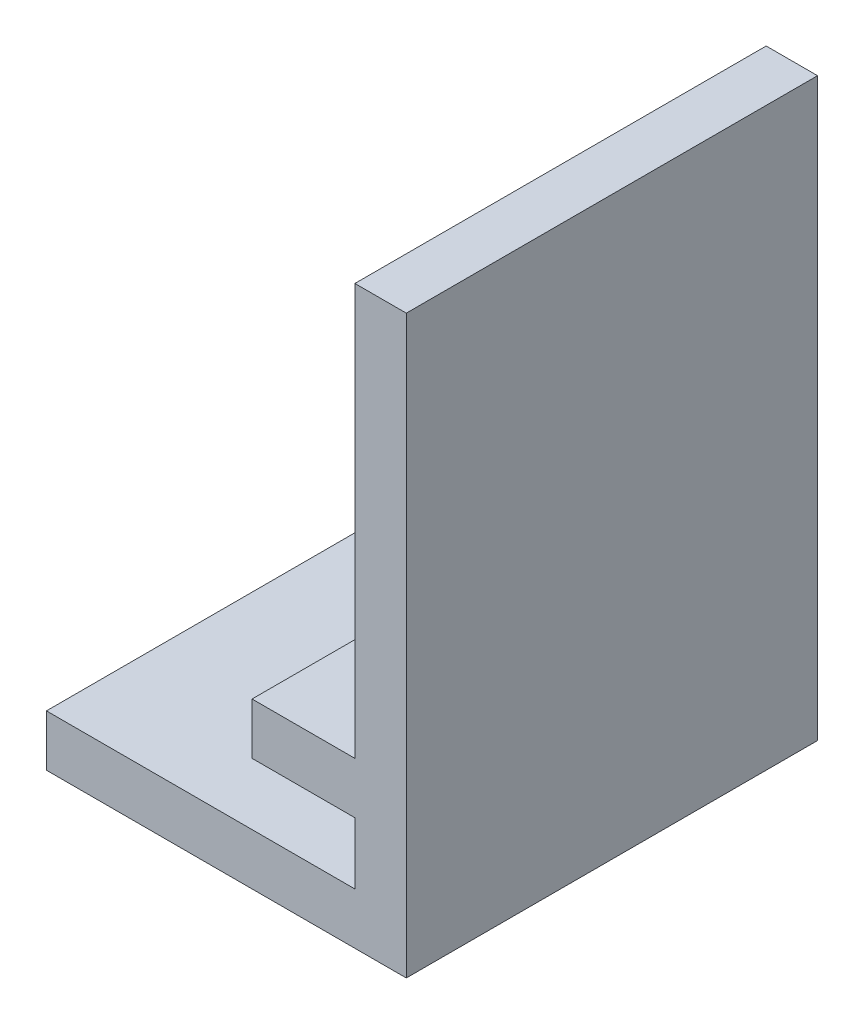
ISO-10303-21;
HEADER;
FILE_DESCRIPTION(('STEP AP214'),'2;1');
FILE_NAME('part.step','',(''),(''),'','','');
FILE_SCHEMA(('AUTOMOTIVE_DESIGN { 1 0 10303 214 1 1 1 1 }'));
ENDSEC;
DATA;
#1=APPLICATION_CONTEXT('core data for automotive mechanical design processes');
#2=APPLICATION_PROTOCOL_DEFINITION('international standard','automotive_design',2000,#1);
#3=PRODUCT_CONTEXT('',#1,'mechanical');
#4=PRODUCT('Part','Part','',(#3));
#5=PRODUCT_RELATED_PRODUCT_CATEGORY('part','',(#4));
#6=PRODUCT_DEFINITION_FORMATION('','',#4);
#7=PRODUCT_DEFINITION_CONTEXT('part definition',#1,'design');
#8=PRODUCT_DEFINITION('design','',#6,#7);
#9=PRODUCT_DEFINITION_SHAPE('','',#8);
#10=(LENGTH_UNIT() NAMED_UNIT(*) SI_UNIT(.MILLI.,.METRE.));
#11=(NAMED_UNIT(*) PLANE_ANGLE_UNIT() SI_UNIT($,.RADIAN.));
#12=(NAMED_UNIT(*) SI_UNIT($,.STERADIAN.) SOLID_ANGLE_UNIT());
#13=UNCERTAINTY_MEASURE_WITH_UNIT(LENGTH_MEASURE(1.E-05),#10,'distance_accuracy_value','');
#14=(GEOMETRIC_REPRESENTATION_CONTEXT(3) GLOBAL_UNCERTAINTY_ASSIGNED_CONTEXT((#13)) GLOBAL_UNIT_ASSIGNED_CONTEXT((#10,
#11,#12)) REPRESENTATION_CONTEXT('',''));
#15=CARTESIAN_POINT('',(0.,0.,0.));
#16=DIRECTION('',(0.,0.,1.));
#17=DIRECTION('',(1.,0.,0.));
#18=AXIS2_PLACEMENT_3D('',#15,#16,#17);
#19=CARTESIAN_POINT('',(-22.225,0.,25.4));
#20=DIRECTION('',(0.,1.,0.));
#21=DIRECTION('',(0.,0.,1.));
#22=AXIS2_PLACEMENT_3D('',#19,#20,#21);
#23=PLANE('',#22);
#24=DIRECTION('',(1.,0.,0.));
#25=VECTOR('',#24,1.);
#26=CARTESIAN_POINT('',(-22.225,0.,0.));
#27=LINE('',#26,#25);
#28=CARTESIAN_POINT('',(-22.225,0.,0.));
#29=VERTEX_POINT('',#28);
#30=CARTESIAN_POINT('',(0.,0.,0.));
#31=VERTEX_POINT('',#30);
#32=EDGE_CURVE('E140',#29,#31,#27,.T.);
#33=ORIENTED_EDGE('',*,*,#32,.T.);
#34=DIRECTION('',(0.,0.,-1.));
#35=VECTOR('',#34,1.);
#36=CARTESIAN_POINT('',(0.,0.,25.4));
#37=LINE('',#36,#35);
#38=CARTESIAN_POINT('',(0.,0.,25.4));
#39=VERTEX_POINT('',#38);
#40=EDGE_CURVE('E11',#39,#31,#37,.T.);
#41=ORIENTED_EDGE('',*,*,#40,.F.);
#42=DIRECTION('',(1.,0.,0.));
#43=VECTOR('',#42,1.);
#44=CARTESIAN_POINT('',(-22.225,0.,25.4));
#45=LINE('',#44,#43);
#46=CARTESIAN_POINT('',(-22.225,0.,25.4));
#47=VERTEX_POINT('',#46);
#48=EDGE_CURVE('E158',#47,#39,#45,.T.);
#49=ORIENTED_EDGE('',*,*,#48,.F.);
#50=DIRECTION('',(0.,0.,-1.));
#51=VECTOR('',#50,1.);
#52=CARTESIAN_POINT('',(-22.225,0.,25.4));
#53=LINE('',#52,#51);
#54=EDGE_CURVE('E136',#47,#29,#53,.T.);
#55=ORIENTED_EDGE('',*,*,#54,.T.);
#56=EDGE_LOOP('',(#33,#41,#49,#55));
#57=FACE_BOUND('',#56,.T.);
#58=ADVANCED_FACE('F32',(#57),#23,.F.);
#59=CARTESIAN_POINT('',(0.,0.,25.4));
#60=DIRECTION('',(-1.,0.,0.));
#61=DIRECTION('',(0.,-1.,0.));
#62=AXIS2_PLACEMENT_3D('',#59,#60,#61);
#63=PLANE('',#62);
#64=DIRECTION('',(0.,1.,0.));
#65=VECTOR('',#64,1.);
#66=CARTESIAN_POINT('',(0.,0.,0.));
#67=LINE('',#66,#65);
#68=CARTESIAN_POINT('',(0.,35.56,0.));
#69=VERTEX_POINT('',#68);
#70=EDGE_CURVE('E143',#31,#69,#67,.T.);
#71=ORIENTED_EDGE('',*,*,#70,.T.);
#72=DIRECTION('',(0.,0.,-1.));
#73=VECTOR('',#72,1.);
#74=CARTESIAN_POINT('',(0.,35.56,25.4));
#75=LINE('',#74,#73);
#76=CARTESIAN_POINT('',(0.,35.56,25.4));
#77=VERTEX_POINT('',#76);
#78=EDGE_CURVE('E40',#77,#69,#75,.T.);
#79=ORIENTED_EDGE('',*,*,#78,.F.);
#80=DIRECTION('',(0.,1.,0.));
#81=VECTOR('',#80,1.);
#82=CARTESIAN_POINT('',(0.,0.,25.4));
#83=LINE('',#82,#81);
#84=EDGE_CURVE('E97',#39,#77,#83,.T.);
#85=ORIENTED_EDGE('',*,*,#84,.F.);
#86=ORIENTED_EDGE('',*,*,#40,.T.);
#87=EDGE_LOOP('',(#71,#79,#85,#86));
#88=FACE_BOUND('',#87,.T.);
#89=ADVANCED_FACE('F207',(#88),#63,.F.);
#90=CARTESIAN_POINT('',(0.,35.56,25.4));
#91=DIRECTION('',(0.,-1.,0.));
#92=DIRECTION('',(0.,0.,-1.));
#93=AXIS2_PLACEMENT_3D('',#90,#91,#92);
#94=PLANE('',#93);
#95=DIRECTION('',(-1.,0.,0.));
#96=VECTOR('',#95,1.);
#97=CARTESIAN_POINT('',(0.,35.56,0.));
#98=LINE('',#97,#96);
#99=CARTESIAN_POINT('',(-3.175,35.56,0.));
#100=VERTEX_POINT('',#99);
#101=EDGE_CURVE('E145',#69,#100,#98,.T.);
#102=ORIENTED_EDGE('',*,*,#101,.T.);
#103=DIRECTION('',(0.,0.,-1.));
#104=VECTOR('',#103,1.);
#105=CARTESIAN_POINT('',(-3.175,35.56,25.4));
#106=LINE('',#105,#104);
#107=CARTESIAN_POINT('',(-3.175,35.56,25.4));
#108=VERTEX_POINT('',#107);
#109=EDGE_CURVE('E171',#108,#100,#106,.T.);
#110=ORIENTED_EDGE('',*,*,#109,.F.);
#111=DIRECTION('',(-1.,0.,0.));
#112=VECTOR('',#111,1.);
#113=CARTESIAN_POINT('',(0.,35.56,25.4));
#114=LINE('',#113,#112);
#115=EDGE_CURVE('E179',#77,#108,#114,.T.);
#116=ORIENTED_EDGE('',*,*,#115,.F.);
#117=ORIENTED_EDGE('',*,*,#78,.T.);
#118=EDGE_LOOP('',(#102,#110,#116,#117));
#119=FACE_BOUND('',#118,.T.);
#120=ADVANCED_FACE('F177',(#119),#94,.F.);
#121=CARTESIAN_POINT('',(-3.175,35.56,25.4));
#122=DIRECTION('',(1.,0.,0.));
#123=DIRECTION('',(0.,1.,0.));
#124=AXIS2_PLACEMENT_3D('',#121,#122,#123);
#125=PLANE('',#124);
#126=DIRECTION('',(0.,-1.,0.));
#127=VECTOR('',#126,1.);
#128=CARTESIAN_POINT('',(-3.175,35.56,0.));
#129=LINE('',#128,#127);
#130=CARTESIAN_POINT('',(-3.175,10.16,0.));
#131=VERTEX_POINT('',#130);
#132=EDGE_CURVE('E147',#100,#131,#129,.T.);
#133=ORIENTED_EDGE('',*,*,#132,.T.);
#134=DIRECTION('',(0.,0.,-1.));
#135=VECTOR('',#134,1.);
#136=CARTESIAN_POINT('',(-3.175,10.16,25.4));
#137=LINE('',#136,#135);
#138=CARTESIAN_POINT('',(-3.175,10.16,25.4));
#139=VERTEX_POINT('',#138);
#140=EDGE_CURVE('E168',#139,#131,#137,.T.);
#141=ORIENTED_EDGE('',*,*,#140,.F.);
#142=DIRECTION('',(0.,-1.,0.));
#143=VECTOR('',#142,1.);
#144=CARTESIAN_POINT('',(-3.175,35.56,25.4));
#145=LINE('',#144,#143);
#146=EDGE_CURVE('E197',#108,#139,#145,.T.);
#147=ORIENTED_EDGE('',*,*,#146,.F.);
#148=ORIENTED_EDGE('',*,*,#109,.T.);
#149=EDGE_LOOP('',(#133,#141,#147,#148));
#150=FACE_BOUND('',#149,.T.);
#151=ADVANCED_FACE('F188',(#150),#125,.F.);
#152=CARTESIAN_POINT('',(-3.175,10.16,25.4));
#153=DIRECTION('',(0.,-1.,0.));
#154=DIRECTION('',(1.,0.,0.));
#155=AXIS2_PLACEMENT_3D('',#152,#153,#154);
#156=PLANE('',#155);
#157=DIRECTION('',(-1.,0.,0.));
#158=VECTOR('',#157,1.);
#159=CARTESIAN_POINT('',(-3.175,10.16,0.));
#160=LINE('',#159,#158);
#161=CARTESIAN_POINT('',(-9.52499999999999,10.16,0.));
#162=VERTEX_POINT('',#161);
#163=EDGE_CURVE('E149',#131,#162,#160,.T.);
#164=ORIENTED_EDGE('',*,*,#163,.T.);
#165=DIRECTION('',(0.,0.,-1.));
#166=VECTOR('',#165,1.);
#167=CARTESIAN_POINT('',(-9.52499999999999,10.16,25.4));
#168=LINE('',#167,#166);
#169=CARTESIAN_POINT('',(-9.52499999999999,10.16,25.4));
#170=VERTEX_POINT('',#169);
#171=EDGE_CURVE('E165',#170,#162,#168,.T.);
#172=ORIENTED_EDGE('',*,*,#171,.F.);
#173=DIRECTION('',(-1.,0.,0.));
#174=VECTOR('',#173,1.);
#175=CARTESIAN_POINT('',(-3.175,10.16,25.4));
#176=LINE('',#175,#174);
#177=EDGE_CURVE('E194',#139,#170,#176,.T.);
#178=ORIENTED_EDGE('',*,*,#177,.F.);
#179=ORIENTED_EDGE('',*,*,#140,.T.);
#180=EDGE_LOOP('',(#164,#172,#178,#179));
#181=FACE_BOUND('',#180,.T.);
#182=ADVANCED_FACE('F192',(#181),#156,.F.);
#183=CARTESIAN_POINT('',(-9.52499999999999,10.16,25.4));
#184=DIRECTION('',(1.,0.,0.));
#185=DIRECTION('',(0.,1.,0.));
#186=AXIS2_PLACEMENT_3D('',#183,#184,#185);
#187=PLANE('',#186);
#188=DIRECTION('',(0.,-1.,0.));
#189=VECTOR('',#188,1.);
#190=CARTESIAN_POINT('',(-9.52499999999999,10.16,0.));
#191=LINE('',#190,#189);
#192=CARTESIAN_POINT('',(-9.525,6.985,0.));
#193=VERTEX_POINT('',#192);
#194=EDGE_CURVE('E151',#162,#193,#191,.T.);
#195=ORIENTED_EDGE('',*,*,#194,.T.);
#196=DIRECTION('',(0.,0.,-1.));
#197=VECTOR('',#196,1.);
#198=CARTESIAN_POINT('',(-9.525,6.985,25.4));
#199=LINE('',#198,#197);
#200=CARTESIAN_POINT('',(-9.525,6.985,25.4));
#201=VERTEX_POINT('',#200);
#202=EDGE_CURVE('E162',#201,#193,#199,.T.);
#203=ORIENTED_EDGE('',*,*,#202,.F.);
#204=DIRECTION('',(0.,-1.,0.));
#205=VECTOR('',#204,1.);
#206=CARTESIAN_POINT('',(-9.52499999999999,10.16,25.4));
#207=LINE('',#206,#205);
#208=EDGE_CURVE('E196',#170,#201,#207,.T.);
#209=ORIENTED_EDGE('',*,*,#208,.F.);
#210=ORIENTED_EDGE('',*,*,#171,.T.);
#211=EDGE_LOOP('',(#195,#203,#209,#210));
#212=FACE_BOUND('',#211,.T.);
#213=ADVANCED_FACE('F219',(#212),#187,.F.);
#214=CARTESIAN_POINT('',(-9.525,6.985,25.4));
#215=DIRECTION('',(0.,1.,0.));
#216=DIRECTION('',(-1.,0.,0.));
#217=AXIS2_PLACEMENT_3D('',#214,#215,#216);
#218=PLANE('',#217);
#219=DIRECTION('',(1.,0.,0.));
#220=VECTOR('',#219,1.);
#221=CARTESIAN_POINT('',(-9.525,6.985,0.));
#222=LINE('',#221,#220);
#223=CARTESIAN_POINT('',(-3.175,6.985,0.));
#224=VERTEX_POINT('',#223);
#225=EDGE_CURVE('E153',#193,#224,#222,.T.);
#226=ORIENTED_EDGE('',*,*,#225,.T.);
#227=DIRECTION('',(0.,0.,-1.));
#228=VECTOR('',#227,1.);
#229=CARTESIAN_POINT('',(-3.175,6.985,25.4));
#230=LINE('',#229,#228);
#231=CARTESIAN_POINT('',(-3.175,6.985,25.4));
#232=VERTEX_POINT('',#231);
#233=EDGE_CURVE('E131',#232,#224,#230,.T.);
#234=ORIENTED_EDGE('',*,*,#233,.F.);
#235=DIRECTION('',(1.,0.,0.));
#236=VECTOR('',#235,1.);
#237=CARTESIAN_POINT('',(-9.525,6.985,25.4));
#238=LINE('',#237,#236);
#239=EDGE_CURVE('E122',#201,#232,#238,.T.);
#240=ORIENTED_EDGE('',*,*,#239,.F.);
#241=ORIENTED_EDGE('',*,*,#202,.T.);
#242=EDGE_LOOP('',(#226,#234,#240,#241));
#243=FACE_BOUND('',#242,.T.);
#244=ADVANCED_FACE('F222',(#243),#218,.F.);
#245=CARTESIAN_POINT('',(-3.175,6.985,25.4));
#246=DIRECTION('',(1.,0.,0.));
#247=DIRECTION('',(0.,0.,-1.));
#248=AXIS2_PLACEMENT_3D('',#245,#246,#247);
#249=PLANE('',#248);
#250=DIRECTION('',(0.,-1.,0.));
#251=VECTOR('',#250,1.);
#252=CARTESIAN_POINT('',(-3.175,6.985,0.));
#253=LINE('',#252,#251);
#254=CARTESIAN_POINT('',(-3.175,3.175,0.));
#255=VERTEX_POINT('',#254);
#256=EDGE_CURVE('E130',#224,#255,#253,.T.);
#257=ORIENTED_EDGE('',*,*,#256,.T.);
#258=DIRECTION('',(0.,0.,-1.));
#259=VECTOR('',#258,1.);
#260=CARTESIAN_POINT('',(-3.175,3.175,25.4));
#261=LINE('',#260,#259);
#262=CARTESIAN_POINT('',(-3.175,3.175,25.4));
#263=VERTEX_POINT('',#262);
#264=EDGE_CURVE('E127',#263,#255,#261,.T.);
#265=ORIENTED_EDGE('',*,*,#264,.F.);
#266=DIRECTION('',(0.,-1.,0.));
#267=VECTOR('',#266,1.);
#268=CARTESIAN_POINT('',(-3.175,6.985,25.4));
#269=LINE('',#268,#267);
#270=EDGE_CURVE('E116',#232,#263,#269,.T.);
#271=ORIENTED_EDGE('',*,*,#270,.F.);
#272=ORIENTED_EDGE('',*,*,#233,.T.);
#273=EDGE_LOOP('',(#257,#265,#271,#272));
#274=FACE_BOUND('',#273,.T.);
#275=ADVANCED_FACE('F128',(#274),#249,.F.);
#276=CARTESIAN_POINT('',(-3.175,3.175,25.4));
#277=DIRECTION('',(0.,-1.,0.));
#278=DIRECTION('',(1.,0.,0.));
#279=AXIS2_PLACEMENT_3D('',#276,#277,#278);
#280=PLANE('',#279);
#281=DIRECTION('',(-1.,0.,0.));
#282=VECTOR('',#281,1.);
#283=CARTESIAN_POINT('',(-3.175,3.175,0.));
#284=LINE('',#283,#282);
#285=CARTESIAN_POINT('',(-22.225,3.175,0.));
#286=VERTEX_POINT('',#285);
#287=EDGE_CURVE('E83',#255,#286,#284,.T.);
#288=ORIENTED_EDGE('',*,*,#287,.T.);
#289=DIRECTION('',(0.,0.,-1.));
#290=VECTOR('',#289,1.);
#291=CARTESIAN_POINT('',(-22.225,3.175,25.4));
#292=LINE('',#291,#290);
#293=CARTESIAN_POINT('',(-22.225,3.175,25.4));
#294=VERTEX_POINT('',#293);
#295=EDGE_CURVE('E132',#294,#286,#292,.T.);
#296=ORIENTED_EDGE('',*,*,#295,.F.);
#297=DIRECTION('',(-1.,0.,0.));
#298=VECTOR('',#297,1.);
#299=CARTESIAN_POINT('',(-3.175,3.175,25.4));
#300=LINE('',#299,#298);
#301=EDGE_CURVE('E120',#263,#294,#300,.T.);
#302=ORIENTED_EDGE('',*,*,#301,.F.);
#303=ORIENTED_EDGE('',*,*,#264,.T.);
#304=EDGE_LOOP('',(#288,#296,#302,#303));
#305=FACE_BOUND('',#304,.T.);
#306=ADVANCED_FACE('F134',(#305),#280,.F.);
#307=CARTESIAN_POINT('',(-22.225,3.175,25.4));
#308=DIRECTION('',(1.,0.,0.));
#309=DIRECTION('',(0.,0.,-1.));
#310=AXIS2_PLACEMENT_3D('',#307,#308,#309);
#311=PLANE('',#310);
#312=DIRECTION('',(0.,-1.,0.));
#313=VECTOR('',#312,1.);
#314=CARTESIAN_POINT('',(-22.225,3.175,0.));
#315=LINE('',#314,#313);
#316=EDGE_CURVE('E89',#286,#29,#315,.T.);
#317=ORIENTED_EDGE('',*,*,#316,.T.);
#318=ORIENTED_EDGE('',*,*,#54,.F.);
#319=DIRECTION('',(0.,-1.,0.));
#320=VECTOR('',#319,1.);
#321=CARTESIAN_POINT('',(-22.225,3.175,25.4));
#322=LINE('',#321,#320);
#323=EDGE_CURVE('E48',#294,#47,#322,.T.);
#324=ORIENTED_EDGE('',*,*,#323,.F.);
#325=ORIENTED_EDGE('',*,*,#295,.T.);
#326=EDGE_LOOP('',(#317,#318,#324,#325));
#327=FACE_BOUND('',#326,.T.);
#328=ADVANCED_FACE('F231',(#327),#311,.F.);
#329=CARTESIAN_POINT('',(0.,0.,25.4));
#330=DIRECTION('',(0.,0.,1.));
#331=DIRECTION('',(1.,0.,0.));
#332=AXIS2_PLACEMENT_3D('',#329,#330,#331);
#333=PLANE('',#332);
#334=ORIENTED_EDGE('',*,*,#48,.T.);
#335=ORIENTED_EDGE('',*,*,#84,.T.);
#336=ORIENTED_EDGE('',*,*,#115,.T.);
#337=ORIENTED_EDGE('',*,*,#146,.T.);
#338=ORIENTED_EDGE('',*,*,#177,.T.);
#339=ORIENTED_EDGE('',*,*,#208,.T.);
#340=ORIENTED_EDGE('',*,*,#239,.T.);
#341=ORIENTED_EDGE('',*,*,#270,.T.);
#342=ORIENTED_EDGE('',*,*,#301,.T.);
#343=ORIENTED_EDGE('',*,*,#323,.T.);
#344=EDGE_LOOP('',(#334,#335,#336,#337,#338,#339,#340,#341,#342,#343));
#345=FACE_BOUND('',#344,.T.);
#346=ADVANCED_FACE('F118',(#345),#333,.T.);
#347=CARTESIAN_POINT('',(0.,0.,0.));
#348=DIRECTION('',(0.,0.,1.));
#349=DIRECTION('',(1.,0.,0.));
#350=AXIS2_PLACEMENT_3D('',#347,#348,#349);
#351=PLANE('',#350);
#352=ORIENTED_EDGE('',*,*,#32,.F.);
#353=ORIENTED_EDGE('',*,*,#316,.F.);
#354=ORIENTED_EDGE('',*,*,#287,.F.);
#355=ORIENTED_EDGE('',*,*,#256,.F.);
#356=ORIENTED_EDGE('',*,*,#225,.F.);
#357=ORIENTED_EDGE('',*,*,#194,.F.);
#358=ORIENTED_EDGE('',*,*,#163,.F.);
#359=ORIENTED_EDGE('',*,*,#132,.F.);
#360=ORIENTED_EDGE('',*,*,#101,.F.);
#361=ORIENTED_EDGE('',*,*,#70,.F.);
#362=EDGE_LOOP('',(#352,#353,#354,#355,#356,#357,#358,#359,#360,#361));
#363=FACE_BOUND('',#362,.T.);
#364=ADVANCED_FACE('F183',(#363),#351,.F.);
#365=CLOSED_SHELL('',(#58,#89,#120,#151,#182,#213,#244,#275,#306,#328,#346,#364));
#366=MANIFOLD_SOLID_BREP('B2',#365);
#367=ADVANCED_BREP_SHAPE_REPRESENTATION('',(#18,#366),#14);
#368=SHAPE_DEFINITION_REPRESENTATION(#9,#367);
ENDSEC;
END-ISO-10303-21;
